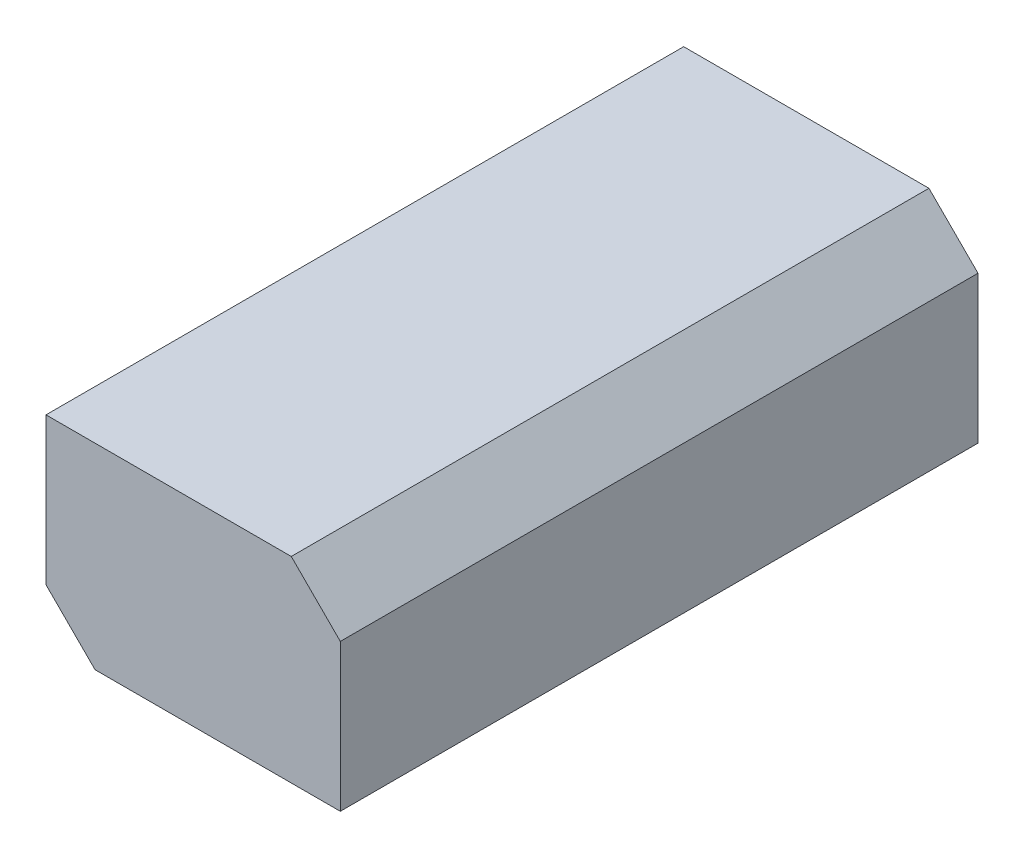
ISO-10303-21;
HEADER;
FILE_DESCRIPTION(('STEP AP214'),'2;1');
FILE_NAME('part.step','',(''),(''),'','','');
FILE_SCHEMA(('AUTOMOTIVE_DESIGN { 1 0 10303 214 1 1 1 1 }'));
ENDSEC;
DATA;
#1=APPLICATION_CONTEXT('core data for automotive mechanical design processes');
#2=APPLICATION_PROTOCOL_DEFINITION('international standard','automotive_design',2000,#1);
#3=PRODUCT_CONTEXT('',#1,'mechanical');
#4=PRODUCT('Part','Part','',(#3));
#5=PRODUCT_RELATED_PRODUCT_CATEGORY('part','',(#4));
#6=PRODUCT_DEFINITION_FORMATION('','',#4);
#7=PRODUCT_DEFINITION_CONTEXT('part definition',#1,'design');
#8=PRODUCT_DEFINITION('design','',#6,#7);
#9=PRODUCT_DEFINITION_SHAPE('','',#8);
#10=(LENGTH_UNIT() NAMED_UNIT(*) SI_UNIT(.MILLI.,.METRE.));
#11=(NAMED_UNIT(*) PLANE_ANGLE_UNIT() SI_UNIT($,.RADIAN.));
#12=(NAMED_UNIT(*) SI_UNIT($,.STERADIAN.) SOLID_ANGLE_UNIT());
#13=UNCERTAINTY_MEASURE_WITH_UNIT(LENGTH_MEASURE(1.E-05),#10,'distance_accuracy_value','');
#14=(GEOMETRIC_REPRESENTATION_CONTEXT(3) GLOBAL_UNCERTAINTY_ASSIGNED_CONTEXT((#13)) GLOBAL_UNIT_ASSIGNED_CONTEXT((#10,
#11,#12)) REPRESENTATION_CONTEXT('',''));
#15=CARTESIAN_POINT('',(0.,0.,0.));
#16=DIRECTION('',(0.,0.,1.));
#17=DIRECTION('',(1.,0.,0.));
#18=AXIS2_PLACEMENT_3D('',#15,#16,#17);
#19=CARTESIAN_POINT('',(0.,0.,130.));
#20=DIRECTION('',(0.999999999999999,0.,0.));
#21=DIRECTION('',(0.,1.,0.));
#22=AXIS2_PLACEMENT_3D('',#19,#20,#21);
#23=PLANE('',#22);
#24=DIRECTION('',(0.,-1.,0.));
#25=VECTOR('',#24,1.);
#26=CARTESIAN_POINT('',(0.,0.,0.));
#27=LINE('',#26,#25);
#28=CARTESIAN_POINT('',(0.,0.,0.));
#29=VERTEX_POINT('',#28);
#30=CARTESIAN_POINT('',(0.,-29.9999999999999,0.));
#31=VERTEX_POINT('',#30);
#32=EDGE_CURVE('E112',#29,#31,#27,.T.);
#33=ORIENTED_EDGE('',*,*,#32,.T.);
#34=DIRECTION('',(0.,0.,0.999999999999999));
#35=VECTOR('',#34,1.);
#36=CARTESIAN_POINT('',(0.,-30.,130.));
#37=LINE('',#36,#35);
#38=CARTESIAN_POINT('',(0.,-30.,130.));
#39=VERTEX_POINT('',#38);
#40=EDGE_CURVE('E127',#31,#39,#37,.T.);
#41=ORIENTED_EDGE('',*,*,#40,.T.);
#42=DIRECTION('',(0.,-1.,0.));
#43=VECTOR('',#42,1.);
#44=CARTESIAN_POINT('',(0.,0.,130.));
#45=LINE('',#44,#43);
#46=CARTESIAN_POINT('',(0.,0.,130.));
#47=VERTEX_POINT('',#46);
#48=EDGE_CURVE('E95',#47,#39,#45,.T.);
#49=ORIENTED_EDGE('',*,*,#48,.F.);
#50=DIRECTION('',(0.,0.,-0.999999999999999));
#51=VECTOR('',#50,1.);
#52=CARTESIAN_POINT('',(0.,0.,130.));
#53=LINE('',#52,#51);
#54=EDGE_CURVE('E104',#47,#29,#53,.T.);
#55=ORIENTED_EDGE('',*,*,#54,.T.);
#56=EDGE_LOOP('',(#33,#41,#49,#55));
#57=FACE_BOUND('',#56,.T.);
#58=ADVANCED_FACE('F34',(#57),#23,.F.);
#59=CARTESIAN_POINT('',(0.,-40.,130.));
#60=DIRECTION('',(0.,1.,0.));
#61=DIRECTION('',(0.,0.,0.999999999999999));
#62=AXIS2_PLACEMENT_3D('',#59,#60,#61);
#63=PLANE('',#62);
#64=DIRECTION('',(0.999999999999999,0.,0.));
#65=VECTOR('',#64,1.);
#66=CARTESIAN_POINT('',(0.,-40.,130.));
#67=LINE('',#66,#65);
#68=CARTESIAN_POINT('',(10.0000000000002,-40.,130.));
#69=VERTEX_POINT('',#68);
#70=CARTESIAN_POINT('',(60.0000000000001,-40.,130.));
#71=VERTEX_POINT('',#70);
#72=EDGE_CURVE('E85',#69,#71,#67,.T.);
#73=ORIENTED_EDGE('',*,*,#72,.F.);
#74=DIRECTION('',(0.,0.,-0.999999999999999));
#75=VECTOR('',#74,1.);
#76=CARTESIAN_POINT('',(10.0000000000002,-40.,130.));
#77=LINE('',#76,#75);
#78=CARTESIAN_POINT('',(10.0000000000002,-40.,0.));
#79=VERTEX_POINT('',#78);
#80=EDGE_CURVE('E103',#69,#79,#77,.T.);
#81=ORIENTED_EDGE('',*,*,#80,.T.);
#82=DIRECTION('',(0.999999999999999,0.,0.));
#83=VECTOR('',#82,1.);
#84=CARTESIAN_POINT('',(0.,-40.,0.));
#85=LINE('',#84,#83);
#86=CARTESIAN_POINT('',(60.0000000000001,-40.,0.));
#87=VERTEX_POINT('',#86);
#88=EDGE_CURVE('E101',#79,#87,#85,.T.);
#89=ORIENTED_EDGE('',*,*,#88,.T.);
#90=DIRECTION('',(0.,0.,-0.999999999999999));
#91=VECTOR('',#90,1.);
#92=CARTESIAN_POINT('',(60.0000000000001,-40.,130.));
#93=LINE('',#92,#91);
#94=EDGE_CURVE('E98',#71,#87,#93,.T.);
#95=ORIENTED_EDGE('',*,*,#94,.F.);
#96=EDGE_LOOP('',(#73,#81,#89,#95));
#97=FACE_BOUND('',#96,.T.);
#98=ADVANCED_FACE('F99',(#97),#63,.F.);
#99=CARTESIAN_POINT('',(60.0000000000001,0.,130.));
#100=DIRECTION('',(-0.999999999999999,0.,0.));
#101=DIRECTION('',(0.,-1.,0.));
#102=AXIS2_PLACEMENT_3D('',#99,#100,#101);
#103=PLANE('',#102);
#104=DIRECTION('',(0.,1.,0.));
#105=VECTOR('',#104,1.);
#106=CARTESIAN_POINT('',(60.0000000000001,0.,0.));
#107=LINE('',#106,#105);
#108=CARTESIAN_POINT('',(60.0000000000001,-10.,0.));
#109=VERTEX_POINT('',#108);
#110=EDGE_CURVE('E116',#87,#109,#107,.T.);
#111=ORIENTED_EDGE('',*,*,#110,.T.);
#112=DIRECTION('',(0.,0.,0.999999999999999));
#113=VECTOR('',#112,1.);
#114=CARTESIAN_POINT('',(60.0000000000001,-10.,130.));
#115=LINE('',#114,#113);
#116=CARTESIAN_POINT('',(60.0000000000001,-10.,130.));
#117=VERTEX_POINT('',#116);
#118=EDGE_CURVE('E11',#109,#117,#115,.T.);
#119=ORIENTED_EDGE('',*,*,#118,.T.);
#120=DIRECTION('',(0.,1.,0.));
#121=VECTOR('',#120,1.);
#122=CARTESIAN_POINT('',(60.0000000000001,0.,130.));
#123=LINE('',#122,#121);
#124=EDGE_CURVE('E89',#71,#117,#123,.T.);
#125=ORIENTED_EDGE('',*,*,#124,.F.);
#126=ORIENTED_EDGE('',*,*,#94,.T.);
#127=EDGE_LOOP('',(#111,#119,#125,#126));
#128=FACE_BOUND('',#127,.T.);
#129=ADVANCED_FACE('F106',(#128),#103,.F.);
#130=CARTESIAN_POINT('',(0.,0.,130.));
#131=DIRECTION('',(0.,-1.,0.));
#132=DIRECTION('',(0.,0.,-0.999999999999999));
#133=AXIS2_PLACEMENT_3D('',#130,#131,#132);
#134=PLANE('',#133);
#135=DIRECTION('',(-0.999999999999999,0.,0.));
#136=VECTOR('',#135,1.);
#137=CARTESIAN_POINT('',(0.,0.,130.));
#138=LINE('',#137,#136);
#139=CARTESIAN_POINT('',(50.,0.,130.));
#140=VERTEX_POINT('',#139);
#141=EDGE_CURVE('E107',#140,#47,#138,.T.);
#142=ORIENTED_EDGE('',*,*,#141,.F.);
#143=DIRECTION('',(0.,0.,-0.999999999999999));
#144=VECTOR('',#143,1.);
#145=CARTESIAN_POINT('',(50.,0.,130.));
#146=LINE('',#145,#144);
#147=CARTESIAN_POINT('',(50.,0.,0.));
#148=VERTEX_POINT('',#147);
#149=EDGE_CURVE('E42',#140,#148,#146,.T.);
#150=ORIENTED_EDGE('',*,*,#149,.T.);
#151=DIRECTION('',(-0.999999999999999,0.,0.));
#152=VECTOR('',#151,1.);
#153=CARTESIAN_POINT('',(0.,0.,0.));
#154=LINE('',#153,#152);
#155=EDGE_CURVE('E118',#148,#29,#154,.T.);
#156=ORIENTED_EDGE('',*,*,#155,.T.);
#157=ORIENTED_EDGE('',*,*,#54,.F.);
#158=EDGE_LOOP('',(#142,#150,#156,#157));
#159=FACE_BOUND('',#158,.T.);
#160=ADVANCED_FACE('F134',(#159),#134,.F.);
#161=CARTESIAN_POINT('',(0.,0.,130.));
#162=DIRECTION('',(0.,0.,0.999999999999999));
#163=DIRECTION('',(0.999999999999999,0.,0.));
#164=AXIS2_PLACEMENT_3D('',#161,#162,#163);
#165=PLANE('',#164);
#166=ORIENTED_EDGE('',*,*,#48,.T.);
#167=DIRECTION('',(-0.707106781186547,0.707106781186548,0.));
#168=VECTOR('',#167,1.);
#169=CARTESIAN_POINT('',(-15.,-15.,130.));
#170=LINE('',#169,#168);
#171=EDGE_CURVE('E91',#39,#69,#170,.F.);
#172=ORIENTED_EDGE('',*,*,#171,.T.);
#173=ORIENTED_EDGE('',*,*,#72,.T.);
#174=ORIENTED_EDGE('',*,*,#124,.T.);
#175=DIRECTION('',(0.707106781186547,-0.707106781186548,0.));
#176=VECTOR('',#175,1.);
#177=CARTESIAN_POINT('',(25.0000000000001,25.0000000000002,130.));
#178=LINE('',#177,#176);
#179=EDGE_CURVE('E49',#117,#140,#178,.F.);
#180=ORIENTED_EDGE('',*,*,#179,.T.);
#181=ORIENTED_EDGE('',*,*,#141,.T.);
#182=EDGE_LOOP('',(#166,#172,#173,#174,#180,#181));
#183=FACE_BOUND('',#182,.T.);
#184=ADVANCED_FACE('F88',(#183),#165,.T.);
#185=CARTESIAN_POINT('',(0.,0.,0.));
#186=DIRECTION('',(0.,0.,0.999999999999999));
#187=DIRECTION('',(0.999999999999999,0.,0.));
#188=AXIS2_PLACEMENT_3D('',#185,#186,#187);
#189=PLANE('',#188);
#190=ORIENTED_EDGE('',*,*,#88,.F.);
#191=DIRECTION('',(0.707106781186547,-0.707106781186548,0.));
#192=VECTOR('',#191,1.);
#193=CARTESIAN_POINT('',(10.0000000000002,-40.,0.));
#194=LINE('',#193,#192);
#195=EDGE_CURVE('E125',#79,#31,#194,.F.);
#196=ORIENTED_EDGE('',*,*,#195,.T.);
#197=ORIENTED_EDGE('',*,*,#32,.F.);
#198=ORIENTED_EDGE('',*,*,#155,.F.);
#199=DIRECTION('',(-0.707106781186547,0.707106781186548,0.));
#200=VECTOR('',#199,1.);
#201=CARTESIAN_POINT('',(50.,0.,0.));
#202=LINE('',#201,#200);
#203=EDGE_CURVE('E123',#148,#109,#202,.F.);
#204=ORIENTED_EDGE('',*,*,#203,.T.);
#205=ORIENTED_EDGE('',*,*,#110,.F.);
#206=EDGE_LOOP('',(#190,#196,#197,#198,#204,#205));
#207=FACE_BOUND('',#206,.T.);
#208=ADVANCED_FACE('F139',(#207),#189,.F.);
#209=CARTESIAN_POINT('',(10.0000000000002,-40.,130.));
#210=DIRECTION('',(0.707106781186547,0.707106781186548,0.));
#211=DIRECTION('',(0.,0.,-0.999999999999999));
#212=AXIS2_PLACEMENT_3D('',#209,#210,#211);
#213=PLANE('',#212);
#214=ORIENTED_EDGE('',*,*,#171,.F.);
#215=ORIENTED_EDGE('',*,*,#40,.F.);
#216=ORIENTED_EDGE('',*,*,#195,.F.);
#217=ORIENTED_EDGE('',*,*,#80,.F.);
#218=EDGE_LOOP('',(#214,#215,#216,#217));
#219=FACE_BOUND('',#218,.T.);
#220=ADVANCED_FACE('F144',(#219),#213,.F.);
#221=CARTESIAN_POINT('',(50.,0.,130.));
#222=DIRECTION('',(-0.707106781186547,-0.707106781186547,0.));
#223=DIRECTION('',(0.,0.,-0.999999999999999));
#224=AXIS2_PLACEMENT_3D('',#221,#222,#223);
#225=PLANE('',#224);
#226=ORIENTED_EDGE('',*,*,#179,.F.);
#227=ORIENTED_EDGE('',*,*,#118,.F.);
#228=ORIENTED_EDGE('',*,*,#203,.F.);
#229=ORIENTED_EDGE('',*,*,#149,.F.);
#230=EDGE_LOOP('',(#226,#227,#228,#229));
#231=FACE_BOUND('',#230,.T.);
#232=ADVANCED_FACE('F36',(#231),#225,.F.);
#233=CLOSED_SHELL('',(#58,#98,#129,#160,#184,#208,#220,#232));
#234=MANIFOLD_SOLID_BREP('B2',#233);
#235=ADVANCED_BREP_SHAPE_REPRESENTATION('',(#18,#234),#14);
#236=SHAPE_DEFINITION_REPRESENTATION(#9,#235);
ENDSEC;
END-ISO-10303-21;
